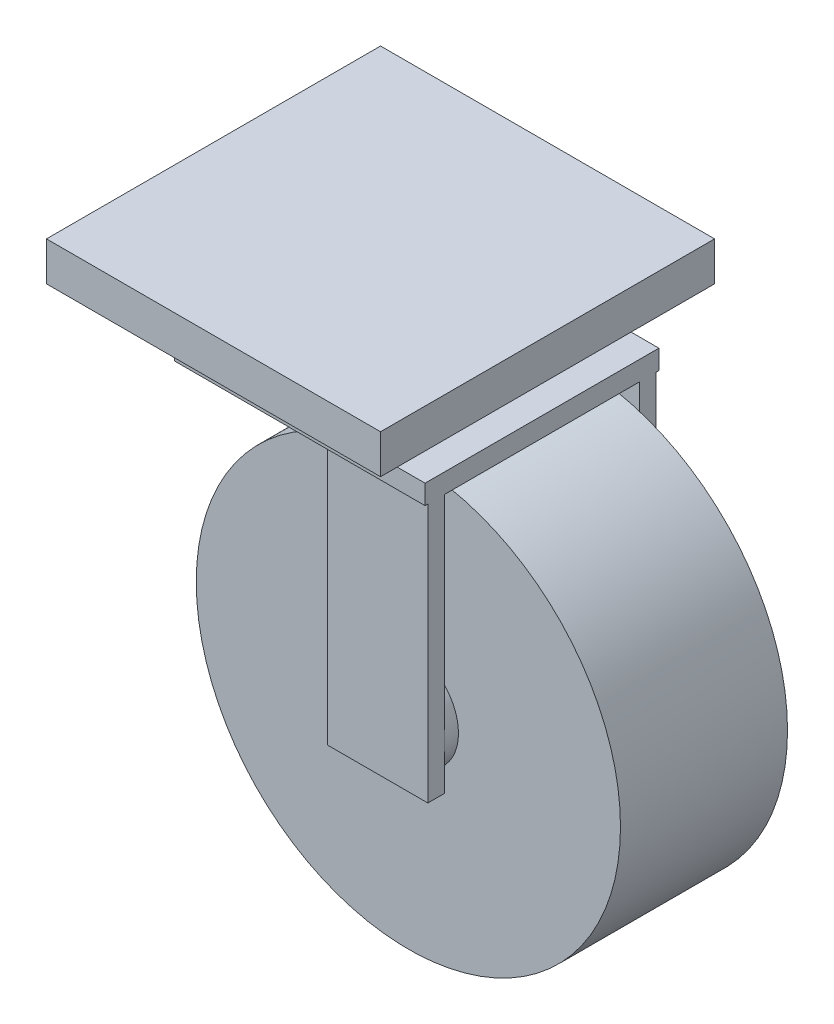
ISO-10303-21;
HEADER;
FILE_DESCRIPTION(('STEP AP214'),'2;1');
FILE_NAME('part.step','',(''),(''),'','','');
FILE_SCHEMA(('AUTOMOTIVE_DESIGN { 1 0 10303 214 1 1 1 1 }'));
ENDSEC;
DATA;
#1=APPLICATION_CONTEXT('core data for automotive mechanical design processes');
#2=APPLICATION_PROTOCOL_DEFINITION('international standard','automotive_design',2000,#1);
#3=PRODUCT_CONTEXT('',#1,'mechanical');
#4=PRODUCT('Part','Part','',(#3));
#5=PRODUCT_RELATED_PRODUCT_CATEGORY('part','',(#4));
#6=PRODUCT_DEFINITION_FORMATION('','',#4);
#7=PRODUCT_DEFINITION_CONTEXT('part definition',#1,'design');
#8=PRODUCT_DEFINITION('design','',#6,#7);
#9=PRODUCT_DEFINITION_SHAPE('','',#8);
#10=(LENGTH_UNIT() NAMED_UNIT(*) SI_UNIT(.MILLI.,.METRE.));
#11=(NAMED_UNIT(*) PLANE_ANGLE_UNIT() SI_UNIT($,.RADIAN.));
#12=(NAMED_UNIT(*) SI_UNIT($,.STERADIAN.) SOLID_ANGLE_UNIT());
#13=UNCERTAINTY_MEASURE_WITH_UNIT(LENGTH_MEASURE(1.E-05),#10,'distance_accuracy_value','');
#14=(GEOMETRIC_REPRESENTATION_CONTEXT(3) GLOBAL_UNCERTAINTY_ASSIGNED_CONTEXT((#13)) GLOBAL_UNIT_ASSIGNED_CONTEXT((#10,
#11,#12)) REPRESENTATION_CONTEXT('',''));
#15=CARTESIAN_POINT('',(0.,0.,0.));
#16=DIRECTION('',(0.,0.,1.));
#17=DIRECTION('',(1.,0.,0.));
#18=AXIS2_PLACEMENT_3D('',#15,#16,#17);
#19=CARTESIAN_POINT('',(5.95,38.1,17.5));
#20=DIRECTION('',(0.,0.,-1.));
#21=DIRECTION('',(-1.,0.,0.));
#22=AXIS2_PLACEMENT_3D('',#19,#20,#21);
#23=CYLINDRICAL_SURFACE('',#22,9.);
#24=CARTESIAN_POINT('',(5.95,38.1,-17.5));
#25=DIRECTION('',(0.,0.,1.));
#26=DIRECTION('',(1.,0.,0.));
#27=AXIS2_PLACEMENT_3D('',#24,#25,#26);
#28=CIRCLE('',#27,9.);
#29=CARTESIAN_POINT('',(14.95,38.1,-17.5));
#30=VERTEX_POINT('',#29);
#31=CARTESIAN_POINT('',(-3.05,38.1,-17.5));
#32=VERTEX_POINT('',#31);
#33=EDGE_CURVE('E449',#30,#32,#28,.T.);
#34=ORIENTED_EDGE('',*,*,#33,.T.);
#35=CARTESIAN_POINT('',(2.0269909508134,30.,-17.5));
#36=VERTEX_POINT('',#35);
#37=EDGE_CURVE('E56',#32,#36,#28,.T.);
#38=ORIENTED_EDGE('',*,*,#37,.T.);
#39=CARTESIAN_POINT('',(9.8730090491866,30.,-17.5));
#40=VERTEX_POINT('',#39);
#41=EDGE_CURVE('E468',#36,#40,#28,.T.);
#42=ORIENTED_EDGE('',*,*,#41,.T.);
#43=EDGE_CURVE('E69',#40,#30,#28,.T.);
#44=ORIENTED_EDGE('',*,*,#43,.T.);
#45=EDGE_LOOP('',(#34,#38,#42,#44));
#46=FACE_BOUND('',#45,.T.);
#47=CARTESIAN_POINT('',(5.95,38.1,-15.));
#48=DIRECTION('',(0.,0.,1.));
#49=DIRECTION('',(1.,0.,0.));
#50=AXIS2_PLACEMENT_3D('',#47,#48,#49);
#51=CIRCLE('',#50,9.);
#52=CARTESIAN_POINT('',(14.95,38.1,-15.));
#53=VERTEX_POINT('',#52);
#54=EDGE_CURVE('E11',#53,#53,#51,.T.);
#55=ORIENTED_EDGE('',*,*,#54,.F.);
#56=EDGE_LOOP('',(#55));
#57=FACE_BOUND('',#56,.T.);
#58=ADVANCED_FACE('F43',(#46,#57),#23,.T.);
#59=CARTESIAN_POINT('',(-3.05,78.,-17.5));
#60=DIRECTION('',(0.,0.,-1.));
#61=DIRECTION('',(-1.,0.,0.));
#62=AXIS2_PLACEMENT_3D('',#59,#60,#61);
#63=PLANE('',#62);
#64=ORIENTED_EDGE('',*,*,#37,.F.);
#65=DIRECTION('',(0.,-1.,0.));
#66=VECTOR('',#65,1.);
#67=CARTESIAN_POINT('',(-3.05,78.,-17.5));
#68=LINE('',#67,#66);
#69=CARTESIAN_POINT('',(-3.05,30.,-17.5));
#70=VERTEX_POINT('',#69);
#71=EDGE_CURVE('E269',#32,#70,#68,.T.);
#72=ORIENTED_EDGE('',*,*,#71,.T.);
#73=DIRECTION('',(1.,0.,0.));
#74=VECTOR('',#73,1.);
#75=CARTESIAN_POINT('',(-3.05,30.,-17.5));
#76=LINE('',#75,#74);
#77=EDGE_CURVE('E255',#70,#36,#76,.T.);
#78=ORIENTED_EDGE('',*,*,#77,.T.);
#79=EDGE_LOOP('',(#64,#72,#78));
#80=FACE_BOUND('',#79,.T.);
#81=ADVANCED_FACE('F372',(#80),#63,.F.);
#82=ORIENTED_EDGE('',*,*,#33,.F.);
#83=DIRECTION('',(0.,-1.,0.));
#84=VECTOR('',#83,1.);
#85=CARTESIAN_POINT('',(14.95,78.,-17.5));
#86=LINE('',#85,#84);
#87=CARTESIAN_POINT('',(14.95,76.5,-17.5));
#88=VERTEX_POINT('',#87);
#89=EDGE_CURVE('E268',#88,#30,#86,.T.);
#90=ORIENTED_EDGE('',*,*,#89,.F.);
#91=DIRECTION('',(-1.,0.,0.));
#92=VECTOR('',#91,1.);
#93=CARTESIAN_POINT('',(0.,76.5,-17.5));
#94=LINE('',#93,#92);
#95=CARTESIAN_POINT('',(-3.05,76.5,-17.5));
#96=VERTEX_POINT('',#95);
#97=EDGE_CURVE('E360',#88,#96,#94,.T.);
#98=ORIENTED_EDGE('',*,*,#97,.T.);
#99=EDGE_CURVE('E271',#96,#32,#68,.T.);
#100=ORIENTED_EDGE('',*,*,#99,.T.);
#101=EDGE_LOOP('',(#82,#90,#98,#100));
#102=FACE_BOUND('',#101,.T.);
#103=ADVANCED_FACE('F368',(#102),#63,.F.);
#104=CARTESIAN_POINT('',(14.95,78.,17.5));
#105=DIRECTION('',(0.,0.,1.));
#106=DIRECTION('',(1.,0.,0.));
#107=AXIS2_PLACEMENT_3D('',#104,#105,#106);
#108=PLANE('',#107);
#109=DIRECTION('',(0.,-1.,0.));
#110=VECTOR('',#109,1.);
#111=CARTESIAN_POINT('',(-3.05,78.,17.5));
#112=LINE('',#111,#110);
#113=CARTESIAN_POINT('',(-3.05,38.1,17.5));
#114=VERTEX_POINT('',#113);
#115=CARTESIAN_POINT('',(-3.05,30.,17.5));
#116=VERTEX_POINT('',#115);
#117=EDGE_CURVE('E223',#114,#116,#112,.T.);
#118=ORIENTED_EDGE('',*,*,#117,.F.);
#119=CARTESIAN_POINT('',(5.95,38.1,17.5));
#120=DIRECTION('',(0.,0.,1.));
#121=DIRECTION('',(1.,0.,0.));
#122=AXIS2_PLACEMENT_3D('',#119,#120,#121);
#123=CIRCLE('',#122,9.);
#124=CARTESIAN_POINT('',(2.0269909508134,30.,17.5));
#125=VERTEX_POINT('',#124);
#126=EDGE_CURVE('E205',#114,#125,#123,.T.);
#127=ORIENTED_EDGE('',*,*,#126,.T.);
#128=DIRECTION('',(-1.,0.,0.));
#129=VECTOR('',#128,1.);
#130=CARTESIAN_POINT('',(14.95,30.,17.5));
#131=LINE('',#130,#129);
#132=EDGE_CURVE('E229',#125,#116,#131,.T.);
#133=ORIENTED_EDGE('',*,*,#132,.T.);
#134=EDGE_LOOP('',(#118,#127,#133));
#135=FACE_BOUND('',#134,.T.);
#136=ADVANCED_FACE('F228',(#135),#108,.F.);
#137=DIRECTION('',(0.,-1.,0.));
#138=VECTOR('',#137,1.);
#139=CARTESIAN_POINT('',(14.95,78.,17.5));
#140=LINE('',#139,#138);
#141=CARTESIAN_POINT('',(14.95,76.5,17.5));
#142=VERTEX_POINT('',#141);
#143=CARTESIAN_POINT('',(14.95,38.1,17.5));
#144=VERTEX_POINT('',#143);
#145=EDGE_CURVE('E225',#142,#144,#140,.T.);
#146=ORIENTED_EDGE('',*,*,#145,.T.);
#147=EDGE_CURVE('E202',#144,#114,#123,.T.);
#148=ORIENTED_EDGE('',*,*,#147,.T.);
#149=CARTESIAN_POINT('',(-3.05,76.5,17.5));
#150=VERTEX_POINT('',#149);
#151=EDGE_CURVE('E219',#150,#114,#112,.T.);
#152=ORIENTED_EDGE('',*,*,#151,.F.);
#153=DIRECTION('',(1.,0.,0.));
#154=VECTOR('',#153,1.);
#155=CARTESIAN_POINT('',(0.,76.5,17.5));
#156=LINE('',#155,#154);
#157=EDGE_CURVE('E241',#150,#142,#156,.T.);
#158=ORIENTED_EDGE('',*,*,#157,.T.);
#159=EDGE_LOOP('',(#146,#148,#152,#158));
#160=FACE_BOUND('',#159,.T.);
#161=ADVANCED_FACE('F220',(#160),#108,.F.);
#162=CARTESIAN_POINT('',(14.95,30.,17.5));
#163=VERTEX_POINT('',#162);
#164=CARTESIAN_POINT('',(9.8730090491866,30.,17.5));
#165=VERTEX_POINT('',#164);
#166=EDGE_CURVE('E232',#163,#165,#131,.T.);
#167=ORIENTED_EDGE('',*,*,#166,.T.);
#168=EDGE_CURVE('E221',#165,#144,#123,.T.);
#169=ORIENTED_EDGE('',*,*,#168,.T.);
#170=EDGE_CURVE('E237',#144,#163,#140,.T.);
#171=ORIENTED_EDGE('',*,*,#170,.T.);
#172=EDGE_LOOP('',(#167,#169,#171));
#173=FACE_BOUND('',#172,.T.);
#174=ADVANCED_FACE('F451',(#173),#108,.F.);
#175=CARTESIAN_POINT('',(0.,76.5,0.));
#176=DIRECTION('',(0.,1.,0.));
#177=DIRECTION('',(0.,0.,1.));
#178=AXIS2_PLACEMENT_3D('',#175,#176,#177);
#179=PLANE('',#178);
#180=DIRECTION('',(-1.,0.,0.));
#181=VECTOR('',#180,1.);
#182=CARTESIAN_POINT('',(0.,76.5,20.5));
#183=LINE('',#182,#181);
#184=CARTESIAN_POINT('',(14.95,76.5,20.5));
#185=VERTEX_POINT('',#184);
#186=CARTESIAN_POINT('',(-3.05,76.5,20.5));
#187=VERTEX_POINT('',#186);
#188=EDGE_CURVE('E249',#185,#187,#183,.T.);
#189=ORIENTED_EDGE('',*,*,#188,.F.);
#190=DIRECTION('',(0.,0.,-1.));
#191=VECTOR('',#190,1.);
#192=CARTESIAN_POINT('',(14.95,76.5,21.));
#193=LINE('',#192,#191);
#194=CARTESIAN_POINT('',(14.95,76.5,21.));
#195=VERTEX_POINT('',#194);
#196=EDGE_CURVE('E297',#195,#185,#193,.T.);
#197=ORIENTED_EDGE('',*,*,#196,.F.);
#198=DIRECTION('',(1.,0.,0.));
#199=VECTOR('',#198,1.);
#200=CARTESIAN_POINT('',(-30.05,76.5,21.));
#201=LINE('',#200,#199);
#202=CARTESIAN_POINT('',(-30.05,76.5,21.));
#203=VERTEX_POINT('',#202);
#204=EDGE_CURVE('E293',#203,#195,#201,.T.);
#205=ORIENTED_EDGE('',*,*,#204,.F.);
#206=DIRECTION('',(0.,0.,1.));
#207=VECTOR('',#206,1.);
#208=CARTESIAN_POINT('',(-30.05,76.5,-21.));
#209=LINE('',#208,#207);
#210=CARTESIAN_POINT('',(-30.05,76.5,-21.));
#211=VERTEX_POINT('',#210);
#212=EDGE_CURVE('E273',#211,#203,#209,.T.);
#213=ORIENTED_EDGE('',*,*,#212,.F.);
#214=DIRECTION('',(-1.,0.,0.));
#215=VECTOR('',#214,1.);
#216=CARTESIAN_POINT('',(14.95,76.5,-21.));
#217=LINE('',#216,#215);
#218=CARTESIAN_POINT('',(14.95,76.5,-21.));
#219=VERTEX_POINT('',#218);
#220=EDGE_CURVE('E302',#219,#211,#217,.T.);
#221=ORIENTED_EDGE('',*,*,#220,.F.);
#222=CARTESIAN_POINT('',(14.95,76.5,-20.5));
#223=VERTEX_POINT('',#222);
#224=EDGE_CURVE('E299',#223,#219,#193,.T.);
#225=ORIENTED_EDGE('',*,*,#224,.F.);
#226=DIRECTION('',(1.,0.,0.));
#227=VECTOR('',#226,1.);
#228=CARTESIAN_POINT('',(0.,76.5,-20.5));
#229=LINE('',#228,#227);
#230=CARTESIAN_POINT('',(-3.05,76.5,-20.5));
#231=VERTEX_POINT('',#230);
#232=EDGE_CURVE('E354',#231,#223,#229,.T.);
#233=ORIENTED_EDGE('',*,*,#232,.F.);
#234=DIRECTION('',(0.,0.,-1.));
#235=VECTOR('',#234,1.);
#236=CARTESIAN_POINT('',(-3.05,76.5,0.));
#237=LINE('',#236,#235);
#238=EDGE_CURVE('E351',#96,#231,#237,.T.);
#239=ORIENTED_EDGE('',*,*,#238,.F.);
#240=ORIENTED_EDGE('',*,*,#97,.F.);
#241=EDGE_CURVE('E304',#142,#88,#193,.T.);
#242=ORIENTED_EDGE('',*,*,#241,.F.);
#243=ORIENTED_EDGE('',*,*,#157,.F.);
#244=DIRECTION('',(0.,0.,-1.));
#245=VECTOR('',#244,1.);
#246=CARTESIAN_POINT('',(-3.05,76.5,0.));
#247=LINE('',#246,#245);
#248=EDGE_CURVE('E55',#187,#150,#247,.T.);
#249=ORIENTED_EDGE('',*,*,#248,.F.);
#250=EDGE_LOOP('',(#189,#197,#205,#213,#221,#225,#233,#239,#240,#242,#243,#249));
#251=FACE_BOUND('',#250,.T.);
#252=ADVANCED_FACE('F397',(#251),#179,.F.);
#253=CARTESIAN_POINT('',(-14.05,80.,0.));
#254=DIRECTION('',(0.,1.,0.));
#255=DIRECTION('',(0.,0.,1.));
#256=AXIS2_PLACEMENT_3D('',#253,#254,#255);
#257=PLANE('',#256);
#258=CARTESIAN_POINT('',(-14.05,80.,0.));
#259=DIRECTION('',(0.,1.,0.));
#260=DIRECTION('',(0.,0.,1.));
#261=AXIS2_PLACEMENT_3D('',#258,#259,#260);
#262=CIRCLE('',#261,22.);
#263=CARTESIAN_POINT('',(-30.05,80.,-15.0996688705415));
#264=VERTEX_POINT('',#263);
#265=CARTESIAN_POINT('',(-30.05,80.,15.0996688705415));
#266=VERTEX_POINT('',#265);
#267=EDGE_CURVE('E415',#264,#266,#262,.T.);
#268=ORIENTED_EDGE('',*,*,#267,.F.);
#269=DIRECTION('',(0.,0.,1.));
#270=VECTOR('',#269,1.);
#271=CARTESIAN_POINT('',(-30.05,80.,-21.));
#272=LINE('',#271,#270);
#273=EDGE_CURVE('E278',#264,#266,#272,.T.);
#274=ORIENTED_EDGE('',*,*,#273,.T.);
#275=EDGE_LOOP('',(#268,#274));
#276=FACE_BOUND('',#275,.T.);
#277=ADVANCED_FACE('F510',(#276),#257,.F.);
#278=CARTESIAN_POINT('',(-20.607438524302,80.,21.));
#279=VERTEX_POINT('',#278);
#280=CARTESIAN_POINT('',(-7.49256147569801,80.,21.));
#281=VERTEX_POINT('',#280);
#282=EDGE_CURVE('E312',#279,#281,#262,.T.);
#283=ORIENTED_EDGE('',*,*,#282,.F.);
#284=DIRECTION('',(1.,0.,0.));
#285=VECTOR('',#284,1.);
#286=CARTESIAN_POINT('',(-30.05,80.,21.));
#287=LINE('',#286,#285);
#288=EDGE_CURVE('E281',#279,#281,#287,.T.);
#289=ORIENTED_EDGE('',*,*,#288,.T.);
#290=EDGE_LOOP('',(#283,#289));
#291=FACE_BOUND('',#290,.T.);
#292=ADVANCED_FACE('F429',(#291),#257,.F.);
#293=CARTESIAN_POINT('',(-44.05,93.,-30.));
#294=DIRECTION('',(1.,0.,0.));
#295=DIRECTION('',(0.,0.,-1.));
#296=AXIS2_PLACEMENT_3D('',#293,#294,#295);
#297=PLANE('',#296);
#298=DIRECTION('',(0.,-1.,0.));
#299=VECTOR('',#298,1.);
#300=CARTESIAN_POINT('',(-44.05,93.,-30.));
#301=LINE('',#300,#299);
#302=CARTESIAN_POINT('',(-44.05,93.,-30.));
#303=VERTEX_POINT('',#302);
#304=CARTESIAN_POINT('',(-44.05,86.,-30.));
#305=VERTEX_POINT('',#304);
#306=EDGE_CURVE('E341',#303,#305,#301,.T.);
#307=ORIENTED_EDGE('',*,*,#306,.T.);
#308=DIRECTION('',(0.,0.,1.));
#309=VECTOR('',#308,1.);
#310=CARTESIAN_POINT('',(-44.05,86.,-30.));
#311=LINE('',#310,#309);
#312=CARTESIAN_POINT('',(-44.05,86.,30.));
#313=VERTEX_POINT('',#312);
#314=EDGE_CURVE('E317',#305,#313,#311,.T.);
#315=ORIENTED_EDGE('',*,*,#314,.T.);
#316=DIRECTION('',(0.,-1.,0.));
#317=VECTOR('',#316,1.);
#318=CARTESIAN_POINT('',(-44.05,93.,30.));
#319=LINE('',#318,#317);
#320=CARTESIAN_POINT('',(-44.05,93.,30.));
#321=VERTEX_POINT('',#320);
#322=EDGE_CURVE('E348',#321,#313,#319,.T.);
#323=ORIENTED_EDGE('',*,*,#322,.F.);
#324=DIRECTION('',(0.,0.,1.));
#325=VECTOR('',#324,1.);
#326=CARTESIAN_POINT('',(-44.05,93.,-30.));
#327=LINE('',#326,#325);
#328=EDGE_CURVE('E333',#303,#321,#327,.T.);
#329=ORIENTED_EDGE('',*,*,#328,.F.);
#330=EDGE_LOOP('',(#307,#315,#323,#329));
#331=FACE_BOUND('',#330,.T.);
#332=ADVANCED_FACE('F44',(#331),#297,.F.);
#333=CARTESIAN_POINT('',(-44.05,93.,30.));
#334=DIRECTION('',(0.,0.,-1.));
#335=DIRECTION('',(-1.,0.,0.));
#336=AXIS2_PLACEMENT_3D('',#333,#334,#335);
#337=PLANE('',#336);
#338=ORIENTED_EDGE('',*,*,#322,.T.);
#339=DIRECTION('',(1.,0.,0.));
#340=VECTOR('',#339,1.);
#341=CARTESIAN_POINT('',(-44.05,86.,30.));
#342=LINE('',#341,#340);
#343=CARTESIAN_POINT('',(15.95,86.,30.));
#344=VERTEX_POINT('',#343);
#345=EDGE_CURVE('E326',#313,#344,#342,.T.);
#346=ORIENTED_EDGE('',*,*,#345,.T.);
#347=DIRECTION('',(0.,-1.,0.));
#348=VECTOR('',#347,1.);
#349=CARTESIAN_POINT('',(15.95,93.,30.));
#350=LINE('',#349,#348);
#351=CARTESIAN_POINT('',(15.95,93.,30.));
#352=VERTEX_POINT('',#351);
#353=EDGE_CURVE('E346',#352,#344,#350,.T.);
#354=ORIENTED_EDGE('',*,*,#353,.F.);
#355=DIRECTION('',(1.,0.,0.));
#356=VECTOR('',#355,1.);
#357=CARTESIAN_POINT('',(-44.05,93.,30.));
#358=LINE('',#357,#356);
#359=EDGE_CURVE('E337',#321,#352,#358,.T.);
#360=ORIENTED_EDGE('',*,*,#359,.F.);
#361=EDGE_LOOP('',(#338,#346,#354,#360));
#362=FACE_BOUND('',#361,.T.);
#363=ADVANCED_FACE('F536',(#362),#337,.F.);
#364=CARTESIAN_POINT('',(15.95,93.,30.));
#365=DIRECTION('',(-1.,0.,0.));
#366=DIRECTION('',(0.,0.,1.));
#367=AXIS2_PLACEMENT_3D('',#364,#365,#366);
#368=PLANE('',#367);
#369=ORIENTED_EDGE('',*,*,#353,.T.);
#370=DIRECTION('',(0.,0.,-1.));
#371=VECTOR('',#370,1.);
#372=CARTESIAN_POINT('',(15.95,86.,30.));
#373=LINE('',#372,#371);
#374=CARTESIAN_POINT('',(15.95,86.,-30.));
#375=VERTEX_POINT('',#374);
#376=EDGE_CURVE('E328',#344,#375,#373,.T.);
#377=ORIENTED_EDGE('',*,*,#376,.T.);
#378=DIRECTION('',(0.,-1.,0.));
#379=VECTOR('',#378,1.);
#380=CARTESIAN_POINT('',(15.95,93.,-30.));
#381=LINE('',#380,#379);
#382=CARTESIAN_POINT('',(15.95,93.,-30.));
#383=VERTEX_POINT('',#382);
#384=EDGE_CURVE('E347',#383,#375,#381,.T.);
#385=ORIENTED_EDGE('',*,*,#384,.F.);
#386=DIRECTION('',(0.,0.,-1.));
#387=VECTOR('',#386,1.);
#388=CARTESIAN_POINT('',(15.95,93.,30.));
#389=LINE('',#388,#387);
#390=EDGE_CURVE('E336',#352,#383,#389,.T.);
#391=ORIENTED_EDGE('',*,*,#390,.F.);
#392=EDGE_LOOP('',(#369,#377,#385,#391));
#393=FACE_BOUND('',#392,.T.);
#394=ADVANCED_FACE('F531',(#393),#368,.F.);
#395=CARTESIAN_POINT('',(15.95,93.,-30.));
#396=DIRECTION('',(0.,0.,1.));
#397=DIRECTION('',(1.,0.,0.));
#398=AXIS2_PLACEMENT_3D('',#395,#396,#397);
#399=PLANE('',#398);
#400=ORIENTED_EDGE('',*,*,#384,.T.);
#401=DIRECTION('',(-1.,0.,0.));
#402=VECTOR('',#401,1.);
#403=CARTESIAN_POINT('',(15.95,86.,-30.));
#404=LINE('',#403,#402);
#405=EDGE_CURVE('E335',#375,#305,#404,.T.);
#406=ORIENTED_EDGE('',*,*,#405,.T.);
#407=ORIENTED_EDGE('',*,*,#306,.F.);
#408=DIRECTION('',(-1.,0.,0.));
#409=VECTOR('',#408,1.);
#410=CARTESIAN_POINT('',(15.95,93.,-30.));
#411=LINE('',#410,#409);
#412=EDGE_CURVE('E344',#383,#303,#411,.T.);
#413=ORIENTED_EDGE('',*,*,#412,.F.);
#414=EDGE_LOOP('',(#400,#406,#407,#413));
#415=FACE_BOUND('',#414,.T.);
#416=ADVANCED_FACE('F530',(#415),#399,.F.);
#417=CARTESIAN_POINT('',(0.,93.,0.));
#418=DIRECTION('',(0.,1.,0.));
#419=DIRECTION('',(0.,0.,1.));
#420=AXIS2_PLACEMENT_3D('',#417,#418,#419);
#421=PLANE('',#420);
#422=ORIENTED_EDGE('',*,*,#328,.T.);
#423=ORIENTED_EDGE('',*,*,#359,.T.);
#424=ORIENTED_EDGE('',*,*,#390,.T.);
#425=ORIENTED_EDGE('',*,*,#412,.T.);
#426=EDGE_LOOP('',(#422,#423,#424,#425));
#427=FACE_BOUND('',#426,.T.);
#428=ADVANCED_FACE('F523',(#427),#421,.T.);
#429=CARTESIAN_POINT('',(0.,86.,0.));
#430=DIRECTION('',(0.,1.,0.));
#431=DIRECTION('',(0.,0.,1.));
#432=AXIS2_PLACEMENT_3D('',#429,#430,#431);
#433=PLANE('',#432);
#434=CARTESIAN_POINT('',(-14.05,86.,0.));
#435=DIRECTION('',(0.,1.,0.));
#436=DIRECTION('',(0.,0.,1.));
#437=AXIS2_PLACEMENT_3D('',#434,#435,#436);
#438=CIRCLE('',#437,22.);
#439=CARTESIAN_POINT('',(-14.05,86.,22.));
#440=VERTEX_POINT('',#439);
#441=EDGE_CURVE('E316',#440,#440,#438,.T.);
#442=ORIENTED_EDGE('',*,*,#441,.T.);
#443=EDGE_LOOP('',(#442));
#444=FACE_BOUND('',#443,.T.);
#445=ORIENTED_EDGE('',*,*,#314,.F.);
#446=ORIENTED_EDGE('',*,*,#405,.F.);
#447=ORIENTED_EDGE('',*,*,#376,.F.);
#448=ORIENTED_EDGE('',*,*,#345,.F.);
#449=EDGE_LOOP('',(#445,#446,#447,#448));
#450=FACE_BOUND('',#449,.T.);
#451=ADVANCED_FACE('F522',(#444,#450),#433,.F.);
#452=CARTESIAN_POINT('',(-14.05,86.,0.));
#453=DIRECTION('',(0.,-1.,0.));
#454=DIRECTION('',(0.,0.,-1.));
#455=AXIS2_PLACEMENT_3D('',#452,#453,#454);
#456=CYLINDRICAL_SURFACE('',#455,22.);
#457=ORIENTED_EDGE('',*,*,#441,.F.);
#458=EDGE_LOOP('',(#457));
#459=FACE_BOUND('',#458,.T.);
#460=CARTESIAN_POINT('',(-7.49256147569799,80.,-21.));
#461=VERTEX_POINT('',#460);
#462=EDGE_CURVE('E319',#281,#461,#262,.T.);
#463=ORIENTED_EDGE('',*,*,#462,.T.);
#464=CARTESIAN_POINT('',(-20.607438524302,80.,-21.));
#465=VERTEX_POINT('',#464);
#466=EDGE_CURVE('E323',#461,#465,#262,.T.);
#467=ORIENTED_EDGE('',*,*,#466,.T.);
#468=EDGE_CURVE('E409',#465,#264,#262,.T.);
#469=ORIENTED_EDGE('',*,*,#468,.T.);
#470=ORIENTED_EDGE('',*,*,#267,.T.);
#471=EDGE_CURVE('E434',#266,#279,#262,.T.);
#472=ORIENTED_EDGE('',*,*,#471,.T.);
#473=ORIENTED_EDGE('',*,*,#282,.T.);
#474=EDGE_LOOP('',(#463,#467,#469,#470,#472,#473));
#475=FACE_BOUND('',#474,.T.);
#476=ADVANCED_FACE('F417',(#459,#475),#456,.T.);
#477=ORIENTED_EDGE('',*,*,#466,.F.);
#478=DIRECTION('',(-1.,0.,0.));
#479=VECTOR('',#478,1.);
#480=CARTESIAN_POINT('',(14.95,80.,-21.));
#481=LINE('',#480,#479);
#482=EDGE_CURVE('E295',#461,#465,#481,.T.);
#483=ORIENTED_EDGE('',*,*,#482,.T.);
#484=EDGE_LOOP('',(#477,#483));
#485=FACE_BOUND('',#484,.T.);
#486=ADVANCED_FACE('F418',(#485),#257,.F.);
#487=CARTESIAN_POINT('',(0.,80.,0.));
#488=DIRECTION('',(0.,1.,0.));
#489=DIRECTION('',(0.,0.,1.));
#490=AXIS2_PLACEMENT_3D('',#487,#488,#489);
#491=PLANE('',#490);
#492=ORIENTED_EDGE('',*,*,#462,.F.);
#493=CARTESIAN_POINT('',(14.95,80.,21.));
#494=VERTEX_POINT('',#493);
#495=EDGE_CURVE('E279',#281,#494,#287,.T.);
#496=ORIENTED_EDGE('',*,*,#495,.T.);
#497=DIRECTION('',(0.,0.,-1.));
#498=VECTOR('',#497,1.);
#499=CARTESIAN_POINT('',(14.95,80.,21.));
#500=LINE('',#499,#498);
#501=CARTESIAN_POINT('',(14.95,80.,-21.));
#502=VERTEX_POINT('',#501);
#503=EDGE_CURVE('E285',#494,#502,#500,.T.);
#504=ORIENTED_EDGE('',*,*,#503,.T.);
#505=EDGE_CURVE('E290',#502,#461,#481,.T.);
#506=ORIENTED_EDGE('',*,*,#505,.T.);
#507=EDGE_LOOP('',(#492,#496,#504,#506));
#508=FACE_BOUND('',#507,.T.);
#509=ADVANCED_FACE('F421',(#508),#491,.T.);
#510=ORIENTED_EDGE('',*,*,#468,.F.);
#511=CARTESIAN_POINT('',(-30.05,80.,-21.));
#512=VERTEX_POINT('',#511);
#513=EDGE_CURVE('E289',#465,#512,#481,.T.);
#514=ORIENTED_EDGE('',*,*,#513,.T.);
#515=EDGE_CURVE('E274',#512,#264,#272,.T.);
#516=ORIENTED_EDGE('',*,*,#515,.T.);
#517=EDGE_LOOP('',(#510,#514,#516));
#518=FACE_BOUND('',#517,.T.);
#519=ADVANCED_FACE('F407',(#518),#491,.T.);
#520=ORIENTED_EDGE('',*,*,#471,.F.);
#521=CARTESIAN_POINT('',(-30.05,80.,21.));
#522=VERTEX_POINT('',#521);
#523=EDGE_CURVE('E276',#266,#522,#272,.T.);
#524=ORIENTED_EDGE('',*,*,#523,.T.);
#525=EDGE_CURVE('E283',#522,#279,#287,.T.);
#526=ORIENTED_EDGE('',*,*,#525,.T.);
#527=EDGE_LOOP('',(#520,#524,#526));
#528=FACE_BOUND('',#527,.T.);
#529=ADVANCED_FACE('F432',(#528),#491,.T.);
#530=CARTESIAN_POINT('',(-30.05,80.,-21.));
#531=DIRECTION('',(1.,0.,0.));
#532=DIRECTION('',(0.,0.,-1.));
#533=AXIS2_PLACEMENT_3D('',#530,#531,#532);
#534=PLANE('',#533);
#535=ORIENTED_EDGE('',*,*,#212,.T.);
#536=DIRECTION('',(0.,-1.,0.));
#537=VECTOR('',#536,1.);
#538=CARTESIAN_POINT('',(-30.05,80.,21.));
#539=LINE('',#538,#537);
#540=EDGE_CURVE('E315',#522,#203,#539,.T.);
#541=ORIENTED_EDGE('',*,*,#540,.F.);
#542=ORIENTED_EDGE('',*,*,#523,.F.);
#543=ORIENTED_EDGE('',*,*,#273,.F.);
#544=ORIENTED_EDGE('',*,*,#515,.F.);
#545=DIRECTION('',(0.,-1.,0.));
#546=VECTOR('',#545,1.);
#547=CARTESIAN_POINT('',(-30.05,80.,-21.));
#548=LINE('',#547,#546);
#549=EDGE_CURVE('E292',#512,#211,#548,.T.);
#550=ORIENTED_EDGE('',*,*,#549,.T.);
#551=EDGE_LOOP('',(#535,#541,#542,#543,#544,#550));
#552=FACE_BOUND('',#551,.T.);
#553=ADVANCED_FACE('F398',(#552),#534,.F.);
#554=CARTESIAN_POINT('',(-30.05,80.,21.));
#555=DIRECTION('',(0.,0.,-1.));
#556=DIRECTION('',(-1.,0.,0.));
#557=AXIS2_PLACEMENT_3D('',#554,#555,#556);
#558=PLANE('',#557);
#559=ORIENTED_EDGE('',*,*,#204,.T.);
#560=DIRECTION('',(0.,-1.,0.));
#561=VECTOR('',#560,1.);
#562=CARTESIAN_POINT('',(14.95,80.,21.));
#563=LINE('',#562,#561);
#564=EDGE_CURVE('E310',#494,#195,#563,.T.);
#565=ORIENTED_EDGE('',*,*,#564,.F.);
#566=ORIENTED_EDGE('',*,*,#495,.F.);
#567=ORIENTED_EDGE('',*,*,#288,.F.);
#568=ORIENTED_EDGE('',*,*,#525,.F.);
#569=ORIENTED_EDGE('',*,*,#540,.T.);
#570=EDGE_LOOP('',(#559,#565,#566,#567,#568,#569));
#571=FACE_BOUND('',#570,.T.);
#572=ADVANCED_FACE('F430',(#571),#558,.F.);
#573=CARTESIAN_POINT('',(14.95,80.,21.));
#574=DIRECTION('',(-1.,0.,0.));
#575=DIRECTION('',(0.,0.,1.));
#576=AXIS2_PLACEMENT_3D('',#573,#574,#575);
#577=PLANE('',#576);
#578=ORIENTED_EDGE('',*,*,#196,.T.);
#579=DIRECTION('',(0.,-1.,0.));
#580=VECTOR('',#579,1.);
#581=CARTESIAN_POINT('',(14.95,78.,20.5));
#582=LINE('',#581,#580);
#583=CARTESIAN_POINT('',(14.95,30.,20.5));
#584=VERTEX_POINT('',#583);
#585=EDGE_CURVE('E243',#185,#584,#582,.T.);
#586=ORIENTED_EDGE('',*,*,#585,.T.);
#587=DIRECTION('',(0.,0.,-1.));
#588=VECTOR('',#587,1.);
#589=CARTESIAN_POINT('',(14.95,30.,20.5));
#590=LINE('',#589,#588);
#591=EDGE_CURVE('E441',#584,#163,#590,.T.);
#592=ORIENTED_EDGE('',*,*,#591,.T.);
#593=ORIENTED_EDGE('',*,*,#170,.F.);
#594=ORIENTED_EDGE('',*,*,#145,.F.);
#595=ORIENTED_EDGE('',*,*,#241,.T.);
#596=ORIENTED_EDGE('',*,*,#89,.T.);
#597=CARTESIAN_POINT('',(14.95,30.,-17.5));
#598=VERTEX_POINT('',#597);
#599=EDGE_CURVE('E270',#30,#598,#86,.T.);
#600=ORIENTED_EDGE('',*,*,#599,.T.);
#601=DIRECTION('',(0.,0.,-1.));
#602=VECTOR('',#601,1.);
#603=CARTESIAN_POINT('',(14.95,30.,-17.5));
#604=LINE('',#603,#602);
#605=CARTESIAN_POINT('',(14.95,30.,-20.5));
#606=VERTEX_POINT('',#605);
#607=EDGE_CURVE('E258',#598,#606,#604,.T.);
#608=ORIENTED_EDGE('',*,*,#607,.T.);
#609=DIRECTION('',(0.,-1.,0.));
#610=VECTOR('',#609,1.);
#611=CARTESIAN_POINT('',(14.95,78.,-20.5));
#612=LINE('',#611,#610);
#613=EDGE_CURVE('E264',#223,#606,#612,.T.);
#614=ORIENTED_EDGE('',*,*,#613,.F.);
#615=ORIENTED_EDGE('',*,*,#224,.T.);
#616=DIRECTION('',(0.,-1.,0.));
#617=VECTOR('',#616,1.);
#618=CARTESIAN_POINT('',(14.95,80.,-21.));
#619=LINE('',#618,#617);
#620=EDGE_CURVE('E308',#502,#219,#619,.T.);
#621=ORIENTED_EDGE('',*,*,#620,.F.);
#622=ORIENTED_EDGE('',*,*,#503,.F.);
#623=ORIENTED_EDGE('',*,*,#564,.T.);
#624=EDGE_LOOP('',(#578,#586,#592,#593,#594,#595,#596,#600,#608,#614,#615,#621,#622,#623));
#625=FACE_BOUND('',#624,.T.);
#626=ADVANCED_FACE('F387',(#625),#577,.F.);
#627=CARTESIAN_POINT('',(14.95,80.,-21.));
#628=DIRECTION('',(0.,0.,1.));
#629=DIRECTION('',(1.,0.,0.));
#630=AXIS2_PLACEMENT_3D('',#627,#628,#629);
#631=PLANE('',#630);
#632=ORIENTED_EDGE('',*,*,#220,.T.);
#633=ORIENTED_EDGE('',*,*,#549,.F.);
#634=ORIENTED_EDGE('',*,*,#513,.F.);
#635=ORIENTED_EDGE('',*,*,#482,.F.);
#636=ORIENTED_EDGE('',*,*,#505,.F.);
#637=ORIENTED_EDGE('',*,*,#620,.T.);
#638=EDGE_LOOP('',(#632,#633,#634,#635,#636,#637));
#639=FACE_BOUND('',#638,.T.);
#640=ADVANCED_FACE('F392',(#639),#631,.F.);
#641=CARTESIAN_POINT('',(-3.05,78.,-20.5));
#642=DIRECTION('',(1.,0.,0.));
#643=DIRECTION('',(0.,0.,-1.));
#644=AXIS2_PLACEMENT_3D('',#641,#642,#643);
#645=PLANE('',#644);
#646=ORIENTED_EDGE('',*,*,#99,.F.);
#647=ORIENTED_EDGE('',*,*,#238,.T.);
#648=DIRECTION('',(0.,-1.,0.));
#649=VECTOR('',#648,1.);
#650=CARTESIAN_POINT('',(-3.05,78.,-20.5));
#651=LINE('',#650,#649);
#652=CARTESIAN_POINT('',(-3.05,30.,-20.5));
#653=VERTEX_POINT('',#652);
#654=EDGE_CURVE('E263',#231,#653,#651,.T.);
#655=ORIENTED_EDGE('',*,*,#654,.T.);
#656=DIRECTION('',(0.,0.,1.));
#657=VECTOR('',#656,1.);
#658=CARTESIAN_POINT('',(-3.05,30.,-20.5));
#659=LINE('',#658,#657);
#660=EDGE_CURVE('E248',#653,#70,#659,.T.);
#661=ORIENTED_EDGE('',*,*,#660,.T.);
#662=ORIENTED_EDGE('',*,*,#71,.F.);
#663=EDGE_LOOP('',(#646,#647,#655,#661,#662));
#664=FACE_BOUND('',#663,.T.);
#665=ADVANCED_FACE('F367',(#664),#645,.F.);
#666=ORIENTED_EDGE('',*,*,#43,.F.);
#667=EDGE_CURVE('E251',#40,#598,#76,.T.);
#668=ORIENTED_EDGE('',*,*,#667,.T.);
#669=ORIENTED_EDGE('',*,*,#599,.F.);
#670=EDGE_LOOP('',(#666,#668,#669));
#671=FACE_BOUND('',#670,.T.);
#672=ADVANCED_FACE('F382',(#671),#63,.F.);
#673=CARTESIAN_POINT('',(14.95,78.,-20.5));
#674=DIRECTION('',(0.,0.,1.));
#675=DIRECTION('',(1.,0.,0.));
#676=AXIS2_PLACEMENT_3D('',#673,#674,#675);
#677=PLANE('',#676);
#678=ORIENTED_EDGE('',*,*,#654,.F.);
#679=ORIENTED_EDGE('',*,*,#232,.T.);
#680=ORIENTED_EDGE('',*,*,#613,.T.);
#681=DIRECTION('',(-1.,0.,0.));
#682=VECTOR('',#681,1.);
#683=CARTESIAN_POINT('',(14.95,30.,-20.5));
#684=LINE('',#683,#682);
#685=EDGE_CURVE('E257',#606,#653,#684,.T.);
#686=ORIENTED_EDGE('',*,*,#685,.T.);
#687=EDGE_LOOP('',(#678,#679,#680,#686));
#688=FACE_BOUND('',#687,.T.);
#689=ADVANCED_FACE('F500',(#688),#677,.F.);
#690=CARTESIAN_POINT('',(0.,30.,0.));
#691=DIRECTION('',(0.,1.,0.));
#692=DIRECTION('',(0.,0.,1.));
#693=AXIS2_PLACEMENT_3D('',#690,#691,#692);
#694=PLANE('',#693);
#695=ORIENTED_EDGE('',*,*,#660,.F.);
#696=ORIENTED_EDGE('',*,*,#685,.F.);
#697=ORIENTED_EDGE('',*,*,#607,.F.);
#698=ORIENTED_EDGE('',*,*,#667,.F.);
#699=EDGE_CURVE('E260',#36,#40,#76,.T.);
#700=ORIENTED_EDGE('',*,*,#699,.F.);
#701=ORIENTED_EDGE('',*,*,#77,.F.);
#702=EDGE_LOOP('',(#695,#696,#697,#698,#700,#701));
#703=FACE_BOUND('',#702,.T.);
#704=ADVANCED_FACE('F380',(#703),#694,.F.);
#705=CARTESIAN_POINT('',(-3.05,78.,17.5));
#706=DIRECTION('',(1.,0.,0.));
#707=DIRECTION('',(0.,0.,-1.));
#708=AXIS2_PLACEMENT_3D('',#705,#706,#707);
#709=PLANE('',#708);
#710=DIRECTION('',(0.,-1.,0.));
#711=VECTOR('',#710,1.);
#712=CARTESIAN_POINT('',(-3.05,78.,20.5));
#713=LINE('',#712,#711);
#714=CARTESIAN_POINT('',(-3.05,30.,20.5));
#715=VERTEX_POINT('',#714);
#716=EDGE_CURVE('E242',#187,#715,#713,.T.);
#717=ORIENTED_EDGE('',*,*,#716,.F.);
#718=ORIENTED_EDGE('',*,*,#248,.T.);
#719=ORIENTED_EDGE('',*,*,#151,.T.);
#720=ORIENTED_EDGE('',*,*,#117,.T.);
#721=DIRECTION('',(0.,0.,1.));
#722=VECTOR('',#721,1.);
#723=CARTESIAN_POINT('',(-3.05,30.,17.5));
#724=LINE('',#723,#722);
#725=EDGE_CURVE('E224',#116,#715,#724,.T.);
#726=ORIENTED_EDGE('',*,*,#725,.T.);
#727=EDGE_LOOP('',(#717,#718,#719,#720,#726));
#728=FACE_BOUND('',#727,.T.);
#729=ADVANCED_FACE('F233',(#728),#709,.F.);
#730=CARTESIAN_POINT('',(-3.05,78.,20.5));
#731=DIRECTION('',(0.,0.,-1.));
#732=DIRECTION('',(-1.,0.,0.));
#733=AXIS2_PLACEMENT_3D('',#730,#731,#732);
#734=PLANE('',#733);
#735=ORIENTED_EDGE('',*,*,#585,.F.);
#736=ORIENTED_EDGE('',*,*,#188,.T.);
#737=ORIENTED_EDGE('',*,*,#716,.T.);
#738=DIRECTION('',(1.,0.,0.));
#739=VECTOR('',#738,1.);
#740=CARTESIAN_POINT('',(-3.05,30.,20.5));
#741=LINE('',#740,#739);
#742=EDGE_CURVE('E445',#715,#584,#741,.T.);
#743=ORIENTED_EDGE('',*,*,#742,.T.);
#744=EDGE_LOOP('',(#735,#736,#737,#743));
#745=FACE_BOUND('',#744,.T.);
#746=ADVANCED_FACE('F437',(#745),#734,.F.);
#747=CARTESIAN_POINT('',(0.,30.,0.));
#748=DIRECTION('',(0.,1.,0.));
#749=DIRECTION('',(0.,0.,1.));
#750=AXIS2_PLACEMENT_3D('',#747,#748,#749);
#751=PLANE('',#750);
#752=ORIENTED_EDGE('',*,*,#725,.F.);
#753=ORIENTED_EDGE('',*,*,#132,.F.);
#754=EDGE_CURVE('E452',#165,#125,#131,.T.);
#755=ORIENTED_EDGE('',*,*,#754,.F.);
#756=ORIENTED_EDGE('',*,*,#166,.F.);
#757=ORIENTED_EDGE('',*,*,#591,.F.);
#758=ORIENTED_EDGE('',*,*,#742,.F.);
#759=EDGE_LOOP('',(#752,#753,#755,#756,#757,#758));
#760=FACE_BOUND('',#759,.T.);
#761=ADVANCED_FACE('F457',(#760),#751,.F.);
#762=CARTESIAN_POINT('',(5.95,38.1,-17.5));
#763=DIRECTION('',(0.,0.,1.));
#764=DIRECTION('',(1.,0.,0.));
#765=AXIS2_PLACEMENT_3D('',#762,#763,#764);
#766=PLANE('',#765);
#767=ORIENTED_EDGE('',*,*,#41,.F.);
#768=ORIENTED_EDGE('',*,*,#699,.T.);
#769=EDGE_LOOP('',(#767,#768));
#770=FACE_BOUND('',#769,.T.);
#771=ADVANCED_FACE('F471',(#770),#766,.F.);
#772=CARTESIAN_POINT('',(5.95,38.1,15.));
#773=DIRECTION('',(0.,0.,1.));
#774=DIRECTION('',(1.,0.,0.));
#775=AXIS2_PLACEMENT_3D('',#772,#773,#774);
#776=CIRCLE('',#775,9.);
#777=CARTESIAN_POINT('',(14.95,38.1,15.));
#778=VERTEX_POINT('',#777);
#779=EDGE_CURVE('E50',#778,#778,#776,.T.);
#780=ORIENTED_EDGE('',*,*,#779,.T.);
#781=EDGE_LOOP('',(#780));
#782=FACE_BOUND('',#781,.T.);
#783=ORIENTED_EDGE('',*,*,#147,.F.);
#784=ORIENTED_EDGE('',*,*,#168,.F.);
#785=EDGE_CURVE('E208',#125,#165,#123,.T.);
#786=ORIENTED_EDGE('',*,*,#785,.F.);
#787=ORIENTED_EDGE('',*,*,#126,.F.);
#788=EDGE_LOOP('',(#783,#784,#786,#787));
#789=FACE_BOUND('',#788,.T.);
#790=ADVANCED_FACE('F204',(#782,#789),#23,.T.);
#791=CARTESIAN_POINT('',(5.95,38.1,17.5));
#792=DIRECTION('',(0.,0.,1.));
#793=DIRECTION('',(1.,0.,0.));
#794=AXIS2_PLACEMENT_3D('',#791,#792,#793);
#795=PLANE('',#794);
#796=ORIENTED_EDGE('',*,*,#785,.T.);
#797=ORIENTED_EDGE('',*,*,#754,.T.);
#798=EDGE_LOOP('',(#796,#797));
#799=FACE_BOUND('',#798,.T.);
#800=ADVANCED_FACE('F456',(#799),#795,.T.);
#801=CARTESIAN_POINT('',(5.95,38.1,15.));
#802=DIRECTION('',(0.,0.,-1.));
#803=DIRECTION('',(-1.,0.,0.));
#804=AXIS2_PLACEMENT_3D('',#801,#802,#803);
#805=CYLINDRICAL_SURFACE('',#804,38.1);
#806=CARTESIAN_POINT('',(5.95,38.1,15.));
#807=DIRECTION('',(0.,0.,1.));
#808=DIRECTION('',(1.,0.,0.));
#809=AXIS2_PLACEMENT_3D('',#806,#807,#808);
#810=CIRCLE('',#809,38.1);
#811=CARTESIAN_POINT('',(44.05,38.1,15.));
#812=VERTEX_POINT('',#811);
#813=EDGE_CURVE('E462',#812,#812,#810,.T.);
#814=ORIENTED_EDGE('',*,*,#813,.F.);
#815=EDGE_LOOP('',(#814));
#816=FACE_BOUND('',#815,.T.);
#817=CARTESIAN_POINT('',(5.95,38.1,-15.));
#818=DIRECTION('',(0.,0.,1.));
#819=DIRECTION('',(1.,0.,0.));
#820=AXIS2_PLACEMENT_3D('',#817,#818,#819);
#821=CIRCLE('',#820,38.1);
#822=CARTESIAN_POINT('',(44.05,38.1,-15.));
#823=VERTEX_POINT('',#822);
#824=EDGE_CURVE('E458',#823,#823,#821,.T.);
#825=ORIENTED_EDGE('',*,*,#824,.T.);
#826=EDGE_LOOP('',(#825));
#827=FACE_BOUND('',#826,.T.);
#828=ADVANCED_FACE('F810',(#816,#827),#805,.T.);
#829=CARTESIAN_POINT('',(5.95,38.1,15.));
#830=DIRECTION('',(0.,0.,1.));
#831=DIRECTION('',(1.,0.,0.));
#832=AXIS2_PLACEMENT_3D('',#829,#830,#831);
#833=PLANE('',#832);
#834=ORIENTED_EDGE('',*,*,#779,.F.);
#835=EDGE_LOOP('',(#834));
#836=FACE_BOUND('',#835,.T.);
#837=ORIENTED_EDGE('',*,*,#813,.T.);
#838=EDGE_LOOP('',(#837));
#839=FACE_BOUND('',#838,.T.);
#840=ADVANCED_FACE('F814',(#836,#839),#833,.T.);
#841=CARTESIAN_POINT('',(5.95,38.1,-15.));
#842=DIRECTION('',(0.,0.,1.));
#843=DIRECTION('',(1.,0.,0.));
#844=AXIS2_PLACEMENT_3D('',#841,#842,#843);
#845=PLANE('',#844);
#846=ORIENTED_EDGE('',*,*,#54,.T.);
#847=EDGE_LOOP('',(#846));
#848=FACE_BOUND('',#847,.T.);
#849=ORIENTED_EDGE('',*,*,#824,.F.);
#850=EDGE_LOOP('',(#849));
#851=FACE_BOUND('',#850,.T.);
#852=ADVANCED_FACE('F824',(#848,#851),#845,.F.);
#853=CLOSED_SHELL('',(#58,#81,#103,#136,#161,#174,#252,#277,#292,#332,#363,#394,#416,#428,#451,
#476,#486,#509,#519,#529,#553,#572,#626,#640,#665,#672,#689,#704,#729,#746,#761,#771,#790,#800,
#828,#840,#852));
#854=MANIFOLD_SOLID_BREP('B2',#853);
#855=ADVANCED_BREP_SHAPE_REPRESENTATION('',(#18,#854),#14);
#856=SHAPE_DEFINITION_REPRESENTATION(#9,#855);
ENDSEC;
END-ISO-10303-21;
